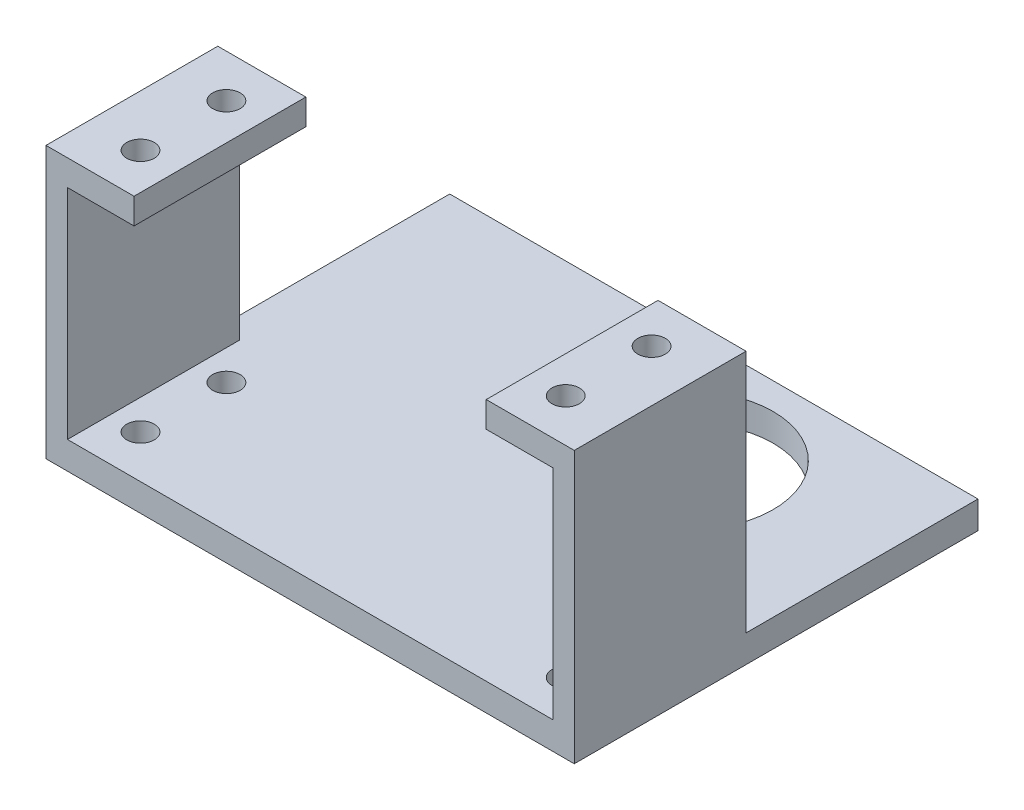
ISO-10303-21;
HEADER;
FILE_DESCRIPTION(('STEP AP214'),'2;1');
FILE_NAME('part.step','',(''),(''),'','','');
FILE_SCHEMA(('AUTOMOTIVE_DESIGN { 1 0 10303 214 1 1 1 1 }'));
ENDSEC;
DATA;
#1=APPLICATION_CONTEXT('core data for automotive mechanical design processes');
#2=APPLICATION_PROTOCOL_DEFINITION('international standard','automotive_design',2000,#1);
#3=PRODUCT_CONTEXT('',#1,'mechanical');
#4=PRODUCT('Part','Part','',(#3));
#5=PRODUCT_RELATED_PRODUCT_CATEGORY('part','',(#4));
#6=PRODUCT_DEFINITION_FORMATION('','',#4);
#7=PRODUCT_DEFINITION_CONTEXT('part definition',#1,'design');
#8=PRODUCT_DEFINITION('design','',#6,#7);
#9=PRODUCT_DEFINITION_SHAPE('','',#8);
#10=(LENGTH_UNIT() NAMED_UNIT(*) SI_UNIT(.MILLI.,.METRE.));
#11=(NAMED_UNIT(*) PLANE_ANGLE_UNIT() SI_UNIT($,.RADIAN.));
#12=(NAMED_UNIT(*) SI_UNIT($,.STERADIAN.) SOLID_ANGLE_UNIT());
#13=UNCERTAINTY_MEASURE_WITH_UNIT(LENGTH_MEASURE(1.E-05),#10,'distance_accuracy_value','');
#14=(GEOMETRIC_REPRESENTATION_CONTEXT(3) GLOBAL_UNCERTAINTY_ASSIGNED_CONTEXT((#13)) GLOBAL_UNIT_ASSIGNED_CONTEXT((#10,
#11,#12)) REPRESENTATION_CONTEXT('',''));
#15=CARTESIAN_POINT('',(0.,0.,0.));
#16=DIRECTION('',(0.,0.,1.));
#17=DIRECTION('',(1.,0.,0.));
#18=AXIS2_PLACEMENT_3D('',#15,#16,#17);
#19=CARTESIAN_POINT('',(-40.75,17.2,34.));
#20=DIRECTION('',(1.,0.,0.));
#21=DIRECTION('',(0.,0.,-1.));
#22=AXIS2_PLACEMENT_3D('',#19,#20,#21);
#23=PLANE('',#22);
#24=DIRECTION('',(0.,0.,1.));
#25=VECTOR('',#24,1.);
#26=CARTESIAN_POINT('',(-40.75,14.,34.));
#27=LINE('',#26,#25);
#28=CARTESIAN_POINT('',(-40.75,14.,-13.));
#29=VERTEX_POINT('',#28);
#30=CARTESIAN_POINT('',(-40.75,14.,34.));
#31=VERTEX_POINT('',#30);
#32=EDGE_CURVE('E191',#29,#31,#27,.T.);
#33=ORIENTED_EDGE('',*,*,#32,.T.);
#34=DIRECTION('',(0.,-1.,0.));
#35=VECTOR('',#34,1.);
#36=CARTESIAN_POINT('',(-40.75,17.2,34.));
#37=LINE('',#36,#35);
#38=CARTESIAN_POINT('',(-40.75,45.6,34.));
#39=VERTEX_POINT('',#38);
#40=EDGE_CURVE('E11',#39,#31,#37,.T.);
#41=ORIENTED_EDGE('',*,*,#40,.F.);
#42=DIRECTION('',(0.,0.,-1.));
#43=VECTOR('',#42,1.);
#44=CARTESIAN_POINT('',(-40.75,45.6,34.));
#45=LINE('',#44,#43);
#46=CARTESIAN_POINT('',(-40.75,45.6,14.));
#47=VERTEX_POINT('',#46);
#48=EDGE_CURVE('E172',#39,#47,#45,.T.);
#49=ORIENTED_EDGE('',*,*,#48,.T.);
#50=DIRECTION('',(0.,-1.,0.));
#51=VECTOR('',#50,1.);
#52=CARTESIAN_POINT('',(-40.75,45.6,14.));
#53=LINE('',#52,#51);
#54=CARTESIAN_POINT('',(-40.75,17.2,14.));
#55=VERTEX_POINT('',#54);
#56=EDGE_CURVE('E174',#47,#55,#53,.T.);
#57=ORIENTED_EDGE('',*,*,#56,.T.);
#58=DIRECTION('',(0.,0.,1.));
#59=VECTOR('',#58,1.);
#60=CARTESIAN_POINT('',(-40.75,17.2,34.));
#61=LINE('',#60,#59);
#62=CARTESIAN_POINT('',(-40.75,17.2,-13.));
#63=VERTEX_POINT('',#62);
#64=EDGE_CURVE('E229',#63,#55,#61,.T.);
#65=ORIENTED_EDGE('',*,*,#64,.F.);
#66=DIRECTION('',(0.,-1.,0.));
#67=VECTOR('',#66,1.);
#68=CARTESIAN_POINT('',(-40.75,17.2,-13.));
#69=LINE('',#68,#67);
#70=EDGE_CURVE('E238',#63,#29,#69,.T.);
#71=ORIENTED_EDGE('',*,*,#70,.T.);
#72=EDGE_LOOP('',(#33,#41,#49,#57,#65,#71));
#73=FACE_BOUND('',#72,.T.);
#74=ADVANCED_FACE('F41',(#73),#23,.F.);
#75=CARTESIAN_POINT('',(20.75,17.2,34.));
#76=DIRECTION('',(0.,0.,-1.));
#77=DIRECTION('',(-1.,0.,0.));
#78=AXIS2_PLACEMENT_3D('',#75,#76,#77);
#79=PLANE('',#78);
#80=DIRECTION('',(1.,0.,0.));
#81=VECTOR('',#80,1.);
#82=CARTESIAN_POINT('',(20.75,14.,34.));
#83=LINE('',#82,#81);
#84=CARTESIAN_POINT('',(20.75,14.,34.));
#85=VERTEX_POINT('',#84);
#86=EDGE_CURVE('E241',#31,#85,#83,.T.);
#87=ORIENTED_EDGE('',*,*,#86,.T.);
#88=DIRECTION('',(0.,-1.,0.));
#89=VECTOR('',#88,1.);
#90=CARTESIAN_POINT('',(20.75,17.2,34.));
#91=LINE('',#90,#89);
#92=CARTESIAN_POINT('',(20.75,45.6,34.));
#93=VERTEX_POINT('',#92);
#94=EDGE_CURVE('E47',#93,#85,#91,.T.);
#95=ORIENTED_EDGE('',*,*,#94,.F.);
#96=DIRECTION('',(-1.,0.,0.));
#97=VECTOR('',#96,1.);
#98=CARTESIAN_POINT('',(10.5,45.6,34.));
#99=LINE('',#98,#97);
#100=CARTESIAN_POINT('',(10.5,45.6,34.));
#101=VERTEX_POINT('',#100);
#102=EDGE_CURVE('E211',#93,#101,#99,.T.);
#103=ORIENTED_EDGE('',*,*,#102,.T.);
#104=DIRECTION('',(0.,-1.,0.));
#105=VECTOR('',#104,1.);
#106=CARTESIAN_POINT('',(10.5,42.6,34.));
#107=LINE('',#106,#105);
#108=CARTESIAN_POINT('',(10.5,42.6,34.));
#109=VERTEX_POINT('',#108);
#110=EDGE_CURVE('E227',#101,#109,#107,.T.);
#111=ORIENTED_EDGE('',*,*,#110,.T.);
#112=DIRECTION('',(1.,0.,0.));
#113=VECTOR('',#112,1.);
#114=CARTESIAN_POINT('',(18.25,42.6,34.));
#115=LINE('',#114,#113);
#116=CARTESIAN_POINT('',(18.25,42.6,34.));
#117=VERTEX_POINT('',#116);
#118=EDGE_CURVE('E224',#109,#117,#115,.T.);
#119=ORIENTED_EDGE('',*,*,#118,.T.);
#120=DIRECTION('',(0.,-1.,0.));
#121=VECTOR('',#120,1.);
#122=CARTESIAN_POINT('',(18.25,17.2,34.));
#123=LINE('',#122,#121);
#124=CARTESIAN_POINT('',(18.25,17.2,34.));
#125=VERTEX_POINT('',#124);
#126=EDGE_CURVE('E212',#117,#125,#123,.T.);
#127=ORIENTED_EDGE('',*,*,#126,.T.);
#128=DIRECTION('',(1.,0.,0.));
#129=VECTOR('',#128,1.);
#130=CARTESIAN_POINT('',(20.75,17.2,34.));
#131=LINE('',#130,#129);
#132=CARTESIAN_POINT('',(-38.25,17.2,34.));
#133=VERTEX_POINT('',#132);
#134=EDGE_CURVE('E148',#133,#125,#131,.T.);
#135=ORIENTED_EDGE('',*,*,#134,.F.);
#136=DIRECTION('',(0.,1.,0.));
#137=VECTOR('',#136,1.);
#138=CARTESIAN_POINT('',(-38.25,17.2,34.));
#139=LINE('',#138,#137);
#140=CARTESIAN_POINT('',(-38.25,42.6,34.));
#141=VERTEX_POINT('',#140);
#142=EDGE_CURVE('E144',#133,#141,#139,.T.);
#143=ORIENTED_EDGE('',*,*,#142,.T.);
#144=DIRECTION('',(1.,0.,0.));
#145=VECTOR('',#144,1.);
#146=CARTESIAN_POINT('',(-38.25,42.6,34.));
#147=LINE('',#146,#145);
#148=CARTESIAN_POINT('',(-30.5,42.6,34.));
#149=VERTEX_POINT('',#148);
#150=EDGE_CURVE('E149',#141,#149,#147,.T.);
#151=ORIENTED_EDGE('',*,*,#150,.T.);
#152=DIRECTION('',(0.,1.,0.));
#153=VECTOR('',#152,1.);
#154=CARTESIAN_POINT('',(-30.5,42.6,34.));
#155=LINE('',#154,#153);
#156=CARTESIAN_POINT('',(-30.5,45.6,34.));
#157=VERTEX_POINT('',#156);
#158=EDGE_CURVE('E168',#149,#157,#155,.T.);
#159=ORIENTED_EDGE('',*,*,#158,.T.);
#160=DIRECTION('',(-1.,0.,0.));
#161=VECTOR('',#160,1.);
#162=CARTESIAN_POINT('',(-30.5,45.6,34.));
#163=LINE('',#162,#161);
#164=EDGE_CURVE('E166',#157,#39,#163,.T.);
#165=ORIENTED_EDGE('',*,*,#164,.T.);
#166=ORIENTED_EDGE('',*,*,#40,.T.);
#167=EDGE_LOOP('',(#87,#95,#103,#111,#119,#127,#135,#143,#151,#159,#165,#166));
#168=FACE_BOUND('',#167,.T.);
#169=ADVANCED_FACE('F147',(#168),#79,.F.);
#170=CARTESIAN_POINT('',(20.75,17.2,-13.));
#171=DIRECTION('',(-1.,0.,0.));
#172=DIRECTION('',(0.,0.,1.));
#173=AXIS2_PLACEMENT_3D('',#170,#171,#172);
#174=PLANE('',#173);
#175=DIRECTION('',(0.,0.,-1.));
#176=VECTOR('',#175,1.);
#177=CARTESIAN_POINT('',(20.75,14.,-13.));
#178=LINE('',#177,#176);
#179=CARTESIAN_POINT('',(20.75,14.,-13.));
#180=VERTEX_POINT('',#179);
#181=EDGE_CURVE('E243',#85,#180,#178,.T.);
#182=ORIENTED_EDGE('',*,*,#181,.T.);
#183=DIRECTION('',(0.,-1.,0.));
#184=VECTOR('',#183,1.);
#185=CARTESIAN_POINT('',(20.75,17.2,-13.));
#186=LINE('',#185,#184);
#187=CARTESIAN_POINT('',(20.75,17.2,-13.));
#188=VERTEX_POINT('',#187);
#189=EDGE_CURVE('E247',#188,#180,#186,.T.);
#190=ORIENTED_EDGE('',*,*,#189,.F.);
#191=DIRECTION('',(0.,0.,-1.));
#192=VECTOR('',#191,1.);
#193=CARTESIAN_POINT('',(20.75,17.2,-13.));
#194=LINE('',#193,#192);
#195=CARTESIAN_POINT('',(20.75,17.2,14.));
#196=VERTEX_POINT('',#195);
#197=EDGE_CURVE('E234',#196,#188,#194,.T.);
#198=ORIENTED_EDGE('',*,*,#197,.F.);
#199=DIRECTION('',(0.,1.,0.));
#200=VECTOR('',#199,1.);
#201=CARTESIAN_POINT('',(20.75,45.6,14.));
#202=LINE('',#201,#200);
#203=CARTESIAN_POINT('',(20.75,45.6,14.));
#204=VERTEX_POINT('',#203);
#205=EDGE_CURVE('E177',#196,#204,#202,.T.);
#206=ORIENTED_EDGE('',*,*,#205,.T.);
#207=DIRECTION('',(0.,0.,-1.));
#208=VECTOR('',#207,1.);
#209=CARTESIAN_POINT('',(20.75,45.6,34.));
#210=LINE('',#209,#208);
#211=EDGE_CURVE('E193',#93,#204,#210,.T.);
#212=ORIENTED_EDGE('',*,*,#211,.F.);
#213=ORIENTED_EDGE('',*,*,#94,.T.);
#214=EDGE_LOOP('',(#182,#190,#198,#206,#212,#213));
#215=FACE_BOUND('',#214,.T.);
#216=ADVANCED_FACE('F316',(#215),#174,.F.);
#217=CARTESIAN_POINT('',(-40.75,17.2,-13.));
#218=DIRECTION('',(0.,0.,1.));
#219=DIRECTION('',(1.,0.,0.));
#220=AXIS2_PLACEMENT_3D('',#217,#218,#219);
#221=PLANE('',#220);
#222=DIRECTION('',(-1.,0.,0.));
#223=VECTOR('',#222,1.);
#224=CARTESIAN_POINT('',(-40.75,14.,-13.));
#225=LINE('',#224,#223);
#226=EDGE_CURVE('E235',#180,#29,#225,.T.);
#227=ORIENTED_EDGE('',*,*,#226,.T.);
#228=ORIENTED_EDGE('',*,*,#70,.F.);
#229=DIRECTION('',(-1.,0.,0.));
#230=VECTOR('',#229,1.);
#231=CARTESIAN_POINT('',(-40.75,17.2,-13.));
#232=LINE('',#231,#230);
#233=EDGE_CURVE('E236',#188,#63,#232,.T.);
#234=ORIENTED_EDGE('',*,*,#233,.F.);
#235=ORIENTED_EDGE('',*,*,#189,.T.);
#236=EDGE_LOOP('',(#227,#228,#234,#235));
#237=FACE_BOUND('',#236,.T.);
#238=ADVANCED_FACE('F345',(#237),#221,.F.);
#239=CARTESIAN_POINT('',(0.,17.2,0.));
#240=DIRECTION('',(0.,-1.,0.));
#241=DIRECTION('',(0.,0.,-1.));
#242=AXIS2_PLACEMENT_3D('',#239,#240,#241);
#243=PLANE('',#242);
#244=CARTESIAN_POINT('',(0.,17.2,0.));
#245=DIRECTION('',(0.,-1.,0.));
#246=DIRECTION('',(0.,0.,-1.));
#247=AXIS2_PLACEMENT_3D('',#244,#245,#246);
#248=CIRCLE('',#247,9.9);
#249=CARTESIAN_POINT('',(0.,17.2,-9.9));
#250=VERTEX_POINT('',#249);
#251=EDGE_CURVE('E260',#250,#250,#248,.T.);
#252=ORIENTED_EDGE('',*,*,#251,.T.);
#253=EDGE_LOOP('',(#252));
#254=FACE_BOUND('',#253,.T.);
#255=CARTESIAN_POINT('',(-34.75,17.2,29.));
#256=DIRECTION('',(0.,-1.,0.));
#257=DIRECTION('',(0.,0.,-1.));
#258=AXIS2_PLACEMENT_3D('',#255,#256,#257);
#259=CIRCLE('',#258,1.6);
#260=CARTESIAN_POINT('',(-34.75,17.2,27.4));
#261=VERTEX_POINT('',#260);
#262=EDGE_CURVE('E268',#261,#261,#259,.T.);
#263=ORIENTED_EDGE('',*,*,#262,.T.);
#264=EDGE_LOOP('',(#263));
#265=FACE_BOUND('',#264,.T.);
#266=CARTESIAN_POINT('',(14.75,17.2,19.));
#267=DIRECTION('',(0.,-1.,0.));
#268=DIRECTION('',(0.,0.,-1.));
#269=AXIS2_PLACEMENT_3D('',#266,#267,#268);
#270=CIRCLE('',#269,1.6);
#271=CARTESIAN_POINT('',(14.75,17.2,17.4));
#272=VERTEX_POINT('',#271);
#273=EDGE_CURVE('E196',#272,#272,#270,.T.);
#274=ORIENTED_EDGE('',*,*,#273,.T.);
#275=EDGE_LOOP('',(#274));
#276=FACE_BOUND('',#275,.T.);
#277=CARTESIAN_POINT('',(14.75,17.2,29.));
#278=DIRECTION('',(0.,-1.,0.));
#279=DIRECTION('',(0.,0.,-1.));
#280=AXIS2_PLACEMENT_3D('',#277,#278,#279);
#281=CIRCLE('',#280,1.6);
#282=CARTESIAN_POINT('',(14.75,17.2,27.4));
#283=VERTEX_POINT('',#282);
#284=EDGE_CURVE('E269',#283,#283,#281,.T.);
#285=ORIENTED_EDGE('',*,*,#284,.T.);
#286=EDGE_LOOP('',(#285));
#287=FACE_BOUND('',#286,.T.);
#288=CARTESIAN_POINT('',(-34.75,17.2,19.));
#289=DIRECTION('',(0.,-1.,0.));
#290=DIRECTION('',(0.,0.,-1.));
#291=AXIS2_PLACEMENT_3D('',#288,#289,#290);
#292=CIRCLE('',#291,1.6);
#293=CARTESIAN_POINT('',(-34.75,17.2,17.4));
#294=VERTEX_POINT('',#293);
#295=EDGE_CURVE('E265',#294,#294,#292,.T.);
#296=ORIENTED_EDGE('',*,*,#295,.T.);
#297=EDGE_LOOP('',(#296));
#298=FACE_BOUND('',#297,.T.);
#299=ORIENTED_EDGE('',*,*,#64,.T.);
#300=DIRECTION('',(1.,0.,0.));
#301=VECTOR('',#300,1.);
#302=CARTESIAN_POINT('',(-40.75,17.2,14.));
#303=LINE('',#302,#301);
#304=CARTESIAN_POINT('',(-38.25,17.2,14.));
#305=VERTEX_POINT('',#304);
#306=EDGE_CURVE('E178',#55,#305,#303,.T.);
#307=ORIENTED_EDGE('',*,*,#306,.T.);
#308=DIRECTION('',(0.,0.,-1.));
#309=VECTOR('',#308,1.);
#310=CARTESIAN_POINT('',(-38.25,17.2,34.));
#311=LINE('',#310,#309);
#312=EDGE_CURVE('E63',#133,#305,#311,.T.);
#313=ORIENTED_EDGE('',*,*,#312,.F.);
#314=ORIENTED_EDGE('',*,*,#134,.T.);
#315=DIRECTION('',(0.,0.,-1.));
#316=VECTOR('',#315,1.);
#317=CARTESIAN_POINT('',(18.25,17.2,34.));
#318=LINE('',#317,#316);
#319=CARTESIAN_POINT('',(18.25,17.2,14.));
#320=VERTEX_POINT('',#319);
#321=EDGE_CURVE('E206',#125,#320,#318,.T.);
#322=ORIENTED_EDGE('',*,*,#321,.T.);
#323=DIRECTION('',(1.,0.,0.));
#324=VECTOR('',#323,1.);
#325=CARTESIAN_POINT('',(20.75,17.2,14.));
#326=LINE('',#325,#324);
#327=EDGE_CURVE('E60',#320,#196,#326,.T.);
#328=ORIENTED_EDGE('',*,*,#327,.T.);
#329=ORIENTED_EDGE('',*,*,#197,.T.);
#330=ORIENTED_EDGE('',*,*,#233,.T.);
#331=EDGE_LOOP('',(#299,#307,#313,#314,#322,#328,#329,#330));
#332=FACE_BOUND('',#331,.T.);
#333=ADVANCED_FACE('F287',(#254,#265,#276,#287,#298,#332),#243,.F.);
#334=CARTESIAN_POINT('',(0.,14.,0.));
#335=DIRECTION('',(0.,-1.,0.));
#336=DIRECTION('',(0.,0.,-1.));
#337=AXIS2_PLACEMENT_3D('',#334,#335,#336);
#338=PLANE('',#337);
#339=CARTESIAN_POINT('',(0.,14.,0.));
#340=DIRECTION('',(0.,-1.,0.));
#341=DIRECTION('',(0.,0.,-1.));
#342=AXIS2_PLACEMENT_3D('',#339,#340,#341);
#343=CIRCLE('',#342,9.9);
#344=CARTESIAN_POINT('',(0.,14.,-9.9));
#345=VERTEX_POINT('',#344);
#346=EDGE_CURVE('E42',#345,#345,#343,.T.);
#347=ORIENTED_EDGE('',*,*,#346,.F.);
#348=EDGE_LOOP('',(#347));
#349=FACE_BOUND('',#348,.T.);
#350=CARTESIAN_POINT('',(-34.75,14.,29.));
#351=DIRECTION('',(0.,-1.,0.));
#352=DIRECTION('',(0.,0.,-1.));
#353=AXIS2_PLACEMENT_3D('',#350,#351,#352);
#354=CIRCLE('',#353,1.6);
#355=CARTESIAN_POINT('',(-34.75,14.,27.4));
#356=VERTEX_POINT('',#355);
#357=EDGE_CURVE('E577',#356,#356,#354,.T.);
#358=ORIENTED_EDGE('',*,*,#357,.F.);
#359=EDGE_LOOP('',(#358));
#360=FACE_BOUND('',#359,.T.);
#361=CARTESIAN_POINT('',(14.75,14.,19.));
#362=DIRECTION('',(0.,-1.,0.));
#363=DIRECTION('',(0.,0.,-1.));
#364=AXIS2_PLACEMENT_3D('',#361,#362,#363);
#365=CIRCLE('',#364,1.6);
#366=CARTESIAN_POINT('',(14.75,14.,17.4));
#367=VERTEX_POINT('',#366);
#368=EDGE_CURVE('E274',#367,#367,#365,.T.);
#369=ORIENTED_EDGE('',*,*,#368,.F.);
#370=EDGE_LOOP('',(#369));
#371=FACE_BOUND('',#370,.T.);
#372=CARTESIAN_POINT('',(14.75,14.,29.));
#373=DIRECTION('',(0.,-1.,0.));
#374=DIRECTION('',(0.,0.,-1.));
#375=AXIS2_PLACEMENT_3D('',#372,#373,#374);
#376=CIRCLE('',#375,1.6);
#377=CARTESIAN_POINT('',(14.75,14.,27.4));
#378=VERTEX_POINT('',#377);
#379=EDGE_CURVE('E280',#378,#378,#376,.T.);
#380=ORIENTED_EDGE('',*,*,#379,.F.);
#381=EDGE_LOOP('',(#380));
#382=FACE_BOUND('',#381,.T.);
#383=CARTESIAN_POINT('',(-34.75,14.,19.));
#384=DIRECTION('',(0.,-1.,0.));
#385=DIRECTION('',(0.,0.,-1.));
#386=AXIS2_PLACEMENT_3D('',#383,#384,#385);
#387=CIRCLE('',#386,1.6);
#388=CARTESIAN_POINT('',(-34.75,14.,17.4));
#389=VERTEX_POINT('',#388);
#390=EDGE_CURVE('E584',#389,#389,#387,.T.);
#391=ORIENTED_EDGE('',*,*,#390,.F.);
#392=EDGE_LOOP('',(#391));
#393=FACE_BOUND('',#392,.T.);
#394=ORIENTED_EDGE('',*,*,#32,.F.);
#395=ORIENTED_EDGE('',*,*,#226,.F.);
#396=ORIENTED_EDGE('',*,*,#181,.F.);
#397=ORIENTED_EDGE('',*,*,#86,.F.);
#398=EDGE_LOOP('',(#394,#395,#396,#397));
#399=FACE_BOUND('',#398,.T.);
#400=ADVANCED_FACE('F323',(#349,#360,#371,#382,#393,#399),#338,.T.);
#401=CARTESIAN_POINT('',(10.5,45.6,34.));
#402=DIRECTION('',(0.,-1.,0.));
#403=DIRECTION('',(0.,0.,-1.));
#404=AXIS2_PLACEMENT_3D('',#401,#402,#403);
#405=PLANE('',#404);
#406=CARTESIAN_POINT('',(14.75,45.6,19.));
#407=DIRECTION('',(0.,-1.,0.));
#408=DIRECTION('',(0.,0.,-1.));
#409=AXIS2_PLACEMENT_3D('',#406,#407,#408);
#410=CIRCLE('',#409,1.6);
#411=CARTESIAN_POINT('',(14.75,45.6,17.4));
#412=VERTEX_POINT('',#411);
#413=EDGE_CURVE('E267',#412,#412,#410,.T.);
#414=ORIENTED_EDGE('',*,*,#413,.T.);
#415=EDGE_LOOP('',(#414));
#416=FACE_BOUND('',#415,.T.);
#417=CARTESIAN_POINT('',(14.75,45.6,29.));
#418=DIRECTION('',(0.,-1.,0.));
#419=DIRECTION('',(0.,0.,-1.));
#420=AXIS2_PLACEMENT_3D('',#417,#418,#419);
#421=CIRCLE('',#420,1.6);
#422=CARTESIAN_POINT('',(14.75,45.6,27.4));
#423=VERTEX_POINT('',#422);
#424=EDGE_CURVE('E263',#423,#423,#421,.T.);
#425=ORIENTED_EDGE('',*,*,#424,.T.);
#426=EDGE_LOOP('',(#425));
#427=FACE_BOUND('',#426,.T.);
#428=DIRECTION('',(-1.,0.,0.));
#429=VECTOR('',#428,1.);
#430=CARTESIAN_POINT('',(10.5,45.6,14.));
#431=LINE('',#430,#429);
#432=CARTESIAN_POINT('',(10.5,45.6,14.));
#433=VERTEX_POINT('',#432);
#434=EDGE_CURVE('E218',#204,#433,#431,.T.);
#435=ORIENTED_EDGE('',*,*,#434,.T.);
#436=DIRECTION('',(0.,0.,-1.));
#437=VECTOR('',#436,1.);
#438=CARTESIAN_POINT('',(10.5,45.6,34.));
#439=LINE('',#438,#437);
#440=EDGE_CURVE('E199',#101,#433,#439,.T.);
#441=ORIENTED_EDGE('',*,*,#440,.F.);
#442=ORIENTED_EDGE('',*,*,#102,.F.);
#443=ORIENTED_EDGE('',*,*,#211,.T.);
#444=EDGE_LOOP('',(#435,#441,#442,#443));
#445=FACE_BOUND('',#444,.T.);
#446=ADVANCED_FACE('F349',(#416,#427,#445),#405,.F.);
#447=CARTESIAN_POINT('',(10.5,42.6,34.));
#448=DIRECTION('',(1.,0.,0.));
#449=DIRECTION('',(0.,0.,-1.));
#450=AXIS2_PLACEMENT_3D('',#447,#448,#449);
#451=PLANE('',#450);
#452=DIRECTION('',(0.,-1.,0.));
#453=VECTOR('',#452,1.);
#454=CARTESIAN_POINT('',(10.5,42.6,14.));
#455=LINE('',#454,#453);
#456=CARTESIAN_POINT('',(10.5,42.6,14.));
#457=VERTEX_POINT('',#456);
#458=EDGE_CURVE('E219',#433,#457,#455,.T.);
#459=ORIENTED_EDGE('',*,*,#458,.T.);
#460=DIRECTION('',(0.,0.,-1.));
#461=VECTOR('',#460,1.);
#462=CARTESIAN_POINT('',(10.5,42.6,34.));
#463=LINE('',#462,#461);
#464=EDGE_CURVE('E205',#109,#457,#463,.T.);
#465=ORIENTED_EDGE('',*,*,#464,.F.);
#466=ORIENTED_EDGE('',*,*,#110,.F.);
#467=ORIENTED_EDGE('',*,*,#440,.T.);
#468=EDGE_LOOP('',(#459,#465,#466,#467));
#469=FACE_BOUND('',#468,.T.);
#470=ADVANCED_FACE('F351',(#469),#451,.F.);
#471=CARTESIAN_POINT('',(18.25,42.6,34.));
#472=DIRECTION('',(0.,1.,0.));
#473=DIRECTION('',(0.,0.,1.));
#474=AXIS2_PLACEMENT_3D('',#471,#472,#473);
#475=PLANE('',#474);
#476=CARTESIAN_POINT('',(14.75,42.6,19.));
#477=DIRECTION('',(0.,1.,0.));
#478=DIRECTION('',(0.,0.,1.));
#479=AXIS2_PLACEMENT_3D('',#476,#477,#478);
#480=CIRCLE('',#479,1.6);
#481=CARTESIAN_POINT('',(14.75,42.6,20.6));
#482=VERTEX_POINT('',#481);
#483=EDGE_CURVE('E270',#482,#482,#480,.T.);
#484=ORIENTED_EDGE('',*,*,#483,.T.);
#485=EDGE_LOOP('',(#484));
#486=FACE_BOUND('',#485,.T.);
#487=CARTESIAN_POINT('',(14.75,42.6,29.));
#488=DIRECTION('',(0.,1.,0.));
#489=DIRECTION('',(0.,0.,1.));
#490=AXIS2_PLACEMENT_3D('',#487,#488,#489);
#491=CIRCLE('',#490,1.6);
#492=CARTESIAN_POINT('',(14.75,42.6,30.6));
#493=VERTEX_POINT('',#492);
#494=EDGE_CURVE('E264',#493,#493,#491,.T.);
#495=ORIENTED_EDGE('',*,*,#494,.T.);
#496=EDGE_LOOP('',(#495));
#497=FACE_BOUND('',#496,.T.);
#498=DIRECTION('',(1.,0.,0.));
#499=VECTOR('',#498,1.);
#500=CARTESIAN_POINT('',(18.25,42.6,14.));
#501=LINE('',#500,#499);
#502=CARTESIAN_POINT('',(18.25,42.6,14.));
#503=VERTEX_POINT('',#502);
#504=EDGE_CURVE('E217',#457,#503,#501,.T.);
#505=ORIENTED_EDGE('',*,*,#504,.T.);
#506=DIRECTION('',(0.,0.,-1.));
#507=VECTOR('',#506,1.);
#508=CARTESIAN_POINT('',(18.25,42.6,34.));
#509=LINE('',#508,#507);
#510=EDGE_CURVE('E204',#117,#503,#509,.T.);
#511=ORIENTED_EDGE('',*,*,#510,.F.);
#512=ORIENTED_EDGE('',*,*,#118,.F.);
#513=ORIENTED_EDGE('',*,*,#464,.T.);
#514=EDGE_LOOP('',(#505,#511,#512,#513));
#515=FACE_BOUND('',#514,.T.);
#516=ADVANCED_FACE('F360',(#486,#497,#515),#475,.F.);
#517=CARTESIAN_POINT('',(18.25,17.2,34.));
#518=DIRECTION('',(1.,0.,0.));
#519=DIRECTION('',(0.,0.,-1.));
#520=AXIS2_PLACEMENT_3D('',#517,#518,#519);
#521=PLANE('',#520);
#522=DIRECTION('',(0.,-1.,0.));
#523=VECTOR('',#522,1.);
#524=CARTESIAN_POINT('',(18.25,17.2,14.));
#525=LINE('',#524,#523);
#526=EDGE_CURVE('E214',#503,#320,#525,.T.);
#527=ORIENTED_EDGE('',*,*,#526,.T.);
#528=ORIENTED_EDGE('',*,*,#321,.F.);
#529=ORIENTED_EDGE('',*,*,#126,.F.);
#530=ORIENTED_EDGE('',*,*,#510,.T.);
#531=EDGE_LOOP('',(#527,#528,#529,#530));
#532=FACE_BOUND('',#531,.T.);
#533=ADVANCED_FACE('F365',(#532),#521,.F.);
#534=CARTESIAN_POINT('',(0.,0.,14.));
#535=DIRECTION('',(0.,0.,-1.));
#536=DIRECTION('',(-1.,0.,0.));
#537=AXIS2_PLACEMENT_3D('',#534,#535,#536);
#538=PLANE('',#537);
#539=ORIENTED_EDGE('',*,*,#205,.F.);
#540=ORIENTED_EDGE('',*,*,#327,.F.);
#541=ORIENTED_EDGE('',*,*,#526,.F.);
#542=ORIENTED_EDGE('',*,*,#504,.F.);
#543=ORIENTED_EDGE('',*,*,#458,.F.);
#544=ORIENTED_EDGE('',*,*,#434,.F.);
#545=EDGE_LOOP('',(#539,#540,#541,#542,#543,#544));
#546=FACE_BOUND('',#545,.T.);
#547=ADVANCED_FACE('F361',(#546),#538,.T.);
#548=CARTESIAN_POINT('',(-38.25,17.2,34.));
#549=DIRECTION('',(-1.,0.,0.));
#550=DIRECTION('',(0.,0.,1.));
#551=AXIS2_PLACEMENT_3D('',#548,#549,#550);
#552=PLANE('',#551);
#553=DIRECTION('',(0.,1.,0.));
#554=VECTOR('',#553,1.);
#555=CARTESIAN_POINT('',(-38.25,17.2,14.));
#556=LINE('',#555,#554);
#557=CARTESIAN_POINT('',(-38.25,42.6,14.));
#558=VERTEX_POINT('',#557);
#559=EDGE_CURVE('E156',#305,#558,#556,.T.);
#560=ORIENTED_EDGE('',*,*,#559,.T.);
#561=DIRECTION('',(0.,0.,-1.));
#562=VECTOR('',#561,1.);
#563=CARTESIAN_POINT('',(-38.25,42.6,34.));
#564=LINE('',#563,#562);
#565=EDGE_CURVE('E153',#141,#558,#564,.T.);
#566=ORIENTED_EDGE('',*,*,#565,.F.);
#567=ORIENTED_EDGE('',*,*,#142,.F.);
#568=ORIENTED_EDGE('',*,*,#312,.T.);
#569=EDGE_LOOP('',(#560,#566,#567,#568));
#570=FACE_BOUND('',#569,.T.);
#571=ADVANCED_FACE('F158',(#570),#552,.F.);
#572=CARTESIAN_POINT('',(-38.25,42.6,34.));
#573=DIRECTION('',(0.,1.,0.));
#574=DIRECTION('',(0.,0.,1.));
#575=AXIS2_PLACEMENT_3D('',#572,#573,#574);
#576=PLANE('',#575);
#577=CARTESIAN_POINT('',(-34.75,42.6,29.));
#578=DIRECTION('',(0.,1.,0.));
#579=DIRECTION('',(0.,0.,1.));
#580=AXIS2_PLACEMENT_3D('',#577,#578,#579);
#581=CIRCLE('',#580,1.6);
#582=CARTESIAN_POINT('',(-34.75,42.6,30.6));
#583=VERTEX_POINT('',#582);
#584=EDGE_CURVE('E262',#583,#583,#581,.T.);
#585=ORIENTED_EDGE('',*,*,#584,.T.);
#586=EDGE_LOOP('',(#585));
#587=FACE_BOUND('',#586,.T.);
#588=CARTESIAN_POINT('',(-34.75,42.6,19.));
#589=DIRECTION('',(0.,1.,0.));
#590=DIRECTION('',(0.,0.,1.));
#591=AXIS2_PLACEMENT_3D('',#588,#589,#590);
#592=CIRCLE('',#591,1.6);
#593=CARTESIAN_POINT('',(-34.75,42.6,20.6));
#594=VERTEX_POINT('',#593);
#595=EDGE_CURVE('E257',#594,#594,#592,.T.);
#596=ORIENTED_EDGE('',*,*,#595,.T.);
#597=EDGE_LOOP('',(#596));
#598=FACE_BOUND('',#597,.T.);
#599=DIRECTION('',(1.,0.,0.));
#600=VECTOR('',#599,1.);
#601=CARTESIAN_POINT('',(-38.25,42.6,14.));
#602=LINE('',#601,#600);
#603=CARTESIAN_POINT('',(-30.5,42.6,14.));
#604=VERTEX_POINT('',#603);
#605=EDGE_CURVE('E185',#558,#604,#602,.T.);
#606=ORIENTED_EDGE('',*,*,#605,.T.);
#607=DIRECTION('',(0.,0.,-1.));
#608=VECTOR('',#607,1.);
#609=CARTESIAN_POINT('',(-30.5,42.6,34.));
#610=LINE('',#609,#608);
#611=EDGE_CURVE('E163',#149,#604,#610,.T.);
#612=ORIENTED_EDGE('',*,*,#611,.F.);
#613=ORIENTED_EDGE('',*,*,#150,.F.);
#614=ORIENTED_EDGE('',*,*,#565,.T.);
#615=EDGE_LOOP('',(#606,#612,#613,#614));
#616=FACE_BOUND('',#615,.T.);
#617=ADVANCED_FACE('F161',(#587,#598,#616),#576,.F.);
#618=CARTESIAN_POINT('',(-30.5,42.6,34.));
#619=DIRECTION('',(-1.,0.,0.));
#620=DIRECTION('',(0.,0.,1.));
#621=AXIS2_PLACEMENT_3D('',#618,#619,#620);
#622=PLANE('',#621);
#623=DIRECTION('',(0.,1.,0.));
#624=VECTOR('',#623,1.);
#625=CARTESIAN_POINT('',(-30.5,42.6,14.));
#626=LINE('',#625,#624);
#627=CARTESIAN_POINT('',(-30.5,45.6,14.));
#628=VERTEX_POINT('',#627);
#629=EDGE_CURVE('E183',#604,#628,#626,.T.);
#630=ORIENTED_EDGE('',*,*,#629,.T.);
#631=DIRECTION('',(0.,0.,-1.));
#632=VECTOR('',#631,1.);
#633=CARTESIAN_POINT('',(-30.5,45.6,34.));
#634=LINE('',#633,#632);
#635=EDGE_CURVE('E186',#157,#628,#634,.T.);
#636=ORIENTED_EDGE('',*,*,#635,.F.);
#637=ORIENTED_EDGE('',*,*,#158,.F.);
#638=ORIENTED_EDGE('',*,*,#611,.T.);
#639=EDGE_LOOP('',(#630,#636,#637,#638));
#640=FACE_BOUND('',#639,.T.);
#641=ADVANCED_FACE('F424',(#640),#622,.F.);
#642=CARTESIAN_POINT('',(-30.5,45.6,34.));
#643=DIRECTION('',(0.,-1.,0.));
#644=DIRECTION('',(0.,0.,-1.));
#645=AXIS2_PLACEMENT_3D('',#642,#643,#644);
#646=PLANE('',#645);
#647=CARTESIAN_POINT('',(-34.75,45.6,29.));
#648=DIRECTION('',(0.,-1.,0.));
#649=DIRECTION('',(0.,0.,-1.));
#650=AXIS2_PLACEMENT_3D('',#647,#648,#649);
#651=CIRCLE('',#650,1.6);
#652=CARTESIAN_POINT('',(-34.75,45.6,27.4));
#653=VERTEX_POINT('',#652);
#654=EDGE_CURVE('E259',#653,#653,#651,.T.);
#655=ORIENTED_EDGE('',*,*,#654,.T.);
#656=EDGE_LOOP('',(#655));
#657=FACE_BOUND('',#656,.T.);
#658=CARTESIAN_POINT('',(-34.75,45.6,19.));
#659=DIRECTION('',(0.,-1.,0.));
#660=DIRECTION('',(0.,0.,-1.));
#661=AXIS2_PLACEMENT_3D('',#658,#659,#660);
#662=CIRCLE('',#661,1.6);
#663=CARTESIAN_POINT('',(-34.75,45.6,17.4));
#664=VERTEX_POINT('',#663);
#665=EDGE_CURVE('E254',#664,#664,#662,.T.);
#666=ORIENTED_EDGE('',*,*,#665,.T.);
#667=EDGE_LOOP('',(#666));
#668=FACE_BOUND('',#667,.T.);
#669=DIRECTION('',(-1.,0.,0.));
#670=VECTOR('',#669,1.);
#671=CARTESIAN_POINT('',(-30.5,45.6,14.));
#672=LINE('',#671,#670);
#673=EDGE_CURVE('E155',#628,#47,#672,.T.);
#674=ORIENTED_EDGE('',*,*,#673,.T.);
#675=ORIENTED_EDGE('',*,*,#48,.F.);
#676=ORIENTED_EDGE('',*,*,#164,.F.);
#677=ORIENTED_EDGE('',*,*,#635,.T.);
#678=EDGE_LOOP('',(#674,#675,#676,#677));
#679=FACE_BOUND('',#678,.T.);
#680=ADVANCED_FACE('F333',(#657,#668,#679),#646,.F.);
#681=CARTESIAN_POINT('',(0.,0.,14.));
#682=DIRECTION('',(0.,0.,1.));
#683=DIRECTION('',(1.,0.,0.));
#684=AXIS2_PLACEMENT_3D('',#681,#682,#683);
#685=PLANE('',#684);
#686=ORIENTED_EDGE('',*,*,#56,.F.);
#687=ORIENTED_EDGE('',*,*,#673,.F.);
#688=ORIENTED_EDGE('',*,*,#629,.F.);
#689=ORIENTED_EDGE('',*,*,#605,.F.);
#690=ORIENTED_EDGE('',*,*,#559,.F.);
#691=ORIENTED_EDGE('',*,*,#306,.F.);
#692=EDGE_LOOP('',(#686,#687,#688,#689,#690,#691));
#693=FACE_BOUND('',#692,.T.);
#694=ADVANCED_FACE('F337',(#693),#685,.F.);
#695=CARTESIAN_POINT('',(-34.75,-53.1,19.));
#696=DIRECTION('',(0.,1.,0.));
#697=DIRECTION('',(0.,0.,1.));
#698=AXIS2_PLACEMENT_3D('',#695,#696,#697);
#699=CYLINDRICAL_SURFACE('',#698,1.6);
#700=ORIENTED_EDGE('',*,*,#665,.F.);
#701=EDGE_LOOP('',(#700));
#702=FACE_BOUND('',#701,.T.);
#703=ORIENTED_EDGE('',*,*,#595,.F.);
#704=EDGE_LOOP('',(#703));
#705=FACE_BOUND('',#704,.T.);
#706=ADVANCED_FACE('F454',(#702,#705),#699,.F.);
#707=CARTESIAN_POINT('',(-34.75,-53.1,29.));
#708=DIRECTION('',(0.,1.,0.));
#709=DIRECTION('',(0.,0.,1.));
#710=AXIS2_PLACEMENT_3D('',#707,#708,#709);
#711=CYLINDRICAL_SURFACE('',#710,1.6);
#712=ORIENTED_EDGE('',*,*,#654,.F.);
#713=EDGE_LOOP('',(#712));
#714=FACE_BOUND('',#713,.T.);
#715=ORIENTED_EDGE('',*,*,#584,.F.);
#716=EDGE_LOOP('',(#715));
#717=FACE_BOUND('',#716,.T.);
#718=ADVANCED_FACE('F304',(#714,#717),#711,.F.);
#719=CARTESIAN_POINT('',(14.75,-53.1,29.));
#720=DIRECTION('',(0.,1.,0.));
#721=DIRECTION('',(0.,0.,1.));
#722=AXIS2_PLACEMENT_3D('',#719,#720,#721);
#723=CYLINDRICAL_SURFACE('',#722,1.6);
#724=ORIENTED_EDGE('',*,*,#494,.F.);
#725=EDGE_LOOP('',(#724));
#726=FACE_BOUND('',#725,.T.);
#727=ORIENTED_EDGE('',*,*,#424,.F.);
#728=EDGE_LOOP('',(#727));
#729=FACE_BOUND('',#728,.T.);
#730=ADVANCED_FACE('F307',(#726,#729),#723,.F.);
#731=CARTESIAN_POINT('',(14.75,-53.1,19.));
#732=DIRECTION('',(0.,1.,0.));
#733=DIRECTION('',(0.,0.,1.));
#734=AXIS2_PLACEMENT_3D('',#731,#732,#733);
#735=CYLINDRICAL_SURFACE('',#734,1.6);
#736=ORIENTED_EDGE('',*,*,#483,.F.);
#737=EDGE_LOOP('',(#736));
#738=FACE_BOUND('',#737,.T.);
#739=ORIENTED_EDGE('',*,*,#413,.F.);
#740=EDGE_LOOP('',(#739));
#741=FACE_BOUND('',#740,.T.);
#742=ADVANCED_FACE('F300',(#738,#741),#735,.F.);
#743=ORIENTED_EDGE('',*,*,#390,.T.);
#744=EDGE_LOOP('',(#743));
#745=FACE_BOUND('',#744,.T.);
#746=ORIENTED_EDGE('',*,*,#295,.F.);
#747=EDGE_LOOP('',(#746));
#748=FACE_BOUND('',#747,.T.);
#749=ADVANCED_FACE('F306',(#745,#748),#699,.F.);
#750=ORIENTED_EDGE('',*,*,#379,.T.);
#751=EDGE_LOOP('',(#750));
#752=FACE_BOUND('',#751,.T.);
#753=ORIENTED_EDGE('',*,*,#284,.F.);
#754=EDGE_LOOP('',(#753));
#755=FACE_BOUND('',#754,.T.);
#756=ADVANCED_FACE('F295',(#752,#755),#723,.F.);
#757=ORIENTED_EDGE('',*,*,#368,.T.);
#758=EDGE_LOOP('',(#757));
#759=FACE_BOUND('',#758,.T.);
#760=ORIENTED_EDGE('',*,*,#273,.F.);
#761=EDGE_LOOP('',(#760));
#762=FACE_BOUND('',#761,.T.);
#763=ADVANCED_FACE('F293',(#759,#762),#735,.F.);
#764=ORIENTED_EDGE('',*,*,#357,.T.);
#765=EDGE_LOOP('',(#764));
#766=FACE_BOUND('',#765,.T.);
#767=ORIENTED_EDGE('',*,*,#262,.F.);
#768=EDGE_LOOP('',(#767));
#769=FACE_BOUND('',#768,.T.);
#770=ADVANCED_FACE('F291',(#766,#769),#711,.F.);
#771=CARTESIAN_POINT('',(0.,-18.2,0.));
#772=DIRECTION('',(0.,1.,0.));
#773=DIRECTION('',(0.,0.,1.));
#774=AXIS2_PLACEMENT_3D('',#771,#772,#773);
#775=CYLINDRICAL_SURFACE('',#774,9.9);
#776=ORIENTED_EDGE('',*,*,#346,.T.);
#777=EDGE_LOOP('',(#776));
#778=FACE_BOUND('',#777,.T.);
#779=ORIENTED_EDGE('',*,*,#251,.F.);
#780=EDGE_LOOP('',(#779));
#781=FACE_BOUND('',#780,.T.);
#782=ADVANCED_FACE('F305',(#778,#781),#775,.F.);
#783=CLOSED_SHELL('',(#74,#169,#216,#238,#333,#400,#446,#470,#516,#533,#547,#571,#617,#641,#680,
#694,#706,#718,#730,#742,#749,#756,#763,#770,#782));
#784=MANIFOLD_SOLID_BREP('B2',#783);
#785=ADVANCED_BREP_SHAPE_REPRESENTATION('',(#18,#784),#14);
#786=SHAPE_DEFINITION_REPRESENTATION(#9,#785);
ENDSEC;
END-ISO-10303-21;
